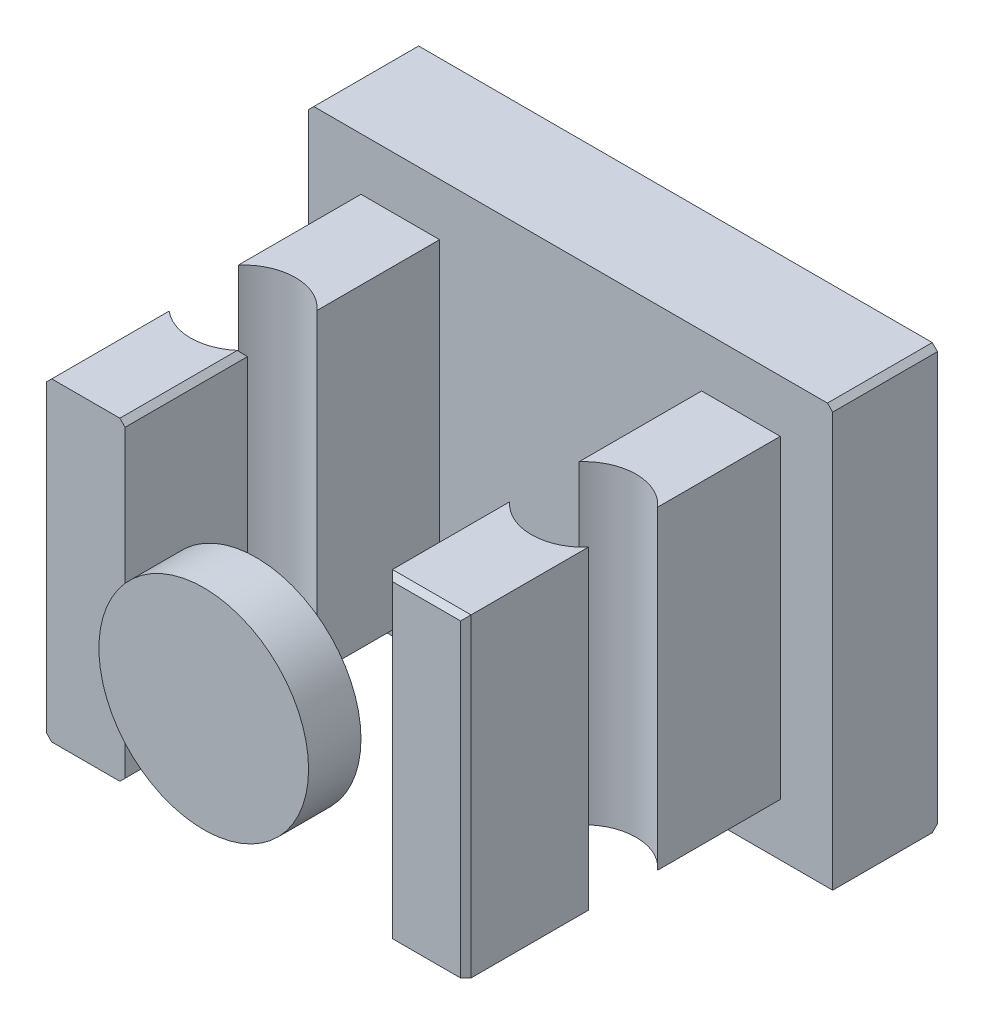
ISO-10303-21;
HEADER;
FILE_DESCRIPTION(('STEP AP214'),'2;1');
FILE_NAME('part.step','',(''),(''),'','','');
FILE_SCHEMA(('AUTOMOTIVE_DESIGN { 1 0 10303 214 1 1 1 1 }'));
ENDSEC;
DATA;
#1=APPLICATION_CONTEXT('core data for automotive mechanical design processes');
#2=APPLICATION_PROTOCOL_DEFINITION('international standard','automotive_design',2000,#1);
#3=PRODUCT_CONTEXT('',#1,'mechanical');
#4=PRODUCT('Part','Part','',(#3));
#5=PRODUCT_RELATED_PRODUCT_CATEGORY('part','',(#4));
#6=PRODUCT_DEFINITION_FORMATION('','',#4);
#7=PRODUCT_DEFINITION_CONTEXT('part definition',#1,'design');
#8=PRODUCT_DEFINITION('design','',#6,#7);
#9=PRODUCT_DEFINITION_SHAPE('','',#8);
#10=(LENGTH_UNIT() NAMED_UNIT(*) SI_UNIT(.MILLI.,.METRE.));
#11=(NAMED_UNIT(*) PLANE_ANGLE_UNIT() SI_UNIT($,.RADIAN.));
#12=(NAMED_UNIT(*) SI_UNIT($,.STERADIAN.) SOLID_ANGLE_UNIT());
#13=UNCERTAINTY_MEASURE_WITH_UNIT(LENGTH_MEASURE(1.E-05),#10,'distance_accuracy_value','');
#14=(GEOMETRIC_REPRESENTATION_CONTEXT(3) GLOBAL_UNCERTAINTY_ASSIGNED_CONTEXT((#13)) GLOBAL_UNIT_ASSIGNED_CONTEXT((#10,
#11,#12)) REPRESENTATION_CONTEXT('',''));
#15=CARTESIAN_POINT('',(0.,0.,0.));
#16=DIRECTION('',(0.,0.,1.));
#17=DIRECTION('',(1.,0.,0.));
#18=AXIS2_PLACEMENT_3D('',#15,#16,#17);
#19=CARTESIAN_POINT('',(0.,0.,90.));
#20=DIRECTION('',(0.,0.,-1.));
#21=DIRECTION('',(-1.,0.,0.));
#22=AXIS2_PLACEMENT_3D('',#19,#20,#21);
#23=CYLINDRICAL_SURFACE('',#22,20.);
#24=CARTESIAN_POINT('',(0.,0.,90.));
#25=DIRECTION('',(0.,0.,1.));
#26=DIRECTION('',(1.,0.,0.));
#27=AXIS2_PLACEMENT_3D('',#24,#25,#26);
#28=CIRCLE('',#27,20.);
#29=CARTESIAN_POINT('',(20.,0.,90.));
#30=VERTEX_POINT('',#29);
#31=EDGE_CURVE('E11',#30,#30,#28,.T.);
#32=ORIENTED_EDGE('',*,*,#31,.F.);
#33=EDGE_LOOP('',(#32));
#34=FACE_BOUND('',#33,.T.);
#35=CARTESIAN_POINT('',(0.,0.,80.));
#36=DIRECTION('',(0.,0.,1.));
#37=DIRECTION('',(1.,0.,0.));
#38=AXIS2_PLACEMENT_3D('',#35,#36,#37);
#39=CIRCLE('',#38,20.);
#40=CARTESIAN_POINT('',(20.,0.,80.));
#41=VERTEX_POINT('',#40);
#42=EDGE_CURVE('E54',#41,#41,#39,.T.);
#43=ORIENTED_EDGE('',*,*,#42,.T.);
#44=EDGE_LOOP('',(#43));
#45=FACE_BOUND('',#44,.T.);
#46=ADVANCED_FACE('F55',(#34,#45),#23,.T.);
#47=CARTESIAN_POINT('',(0.,0.,90.));
#48=DIRECTION('',(0.,0.,1.));
#49=DIRECTION('',(1.,0.,0.));
#50=AXIS2_PLACEMENT_3D('',#47,#48,#49);
#51=PLANE('',#50);
#52=ORIENTED_EDGE('',*,*,#31,.T.);
#53=EDGE_LOOP('',(#52));
#54=FACE_BOUND('',#53,.T.);
#55=ADVANCED_FACE('F67',(#54),#51,.T.);
#56=CARTESIAN_POINT('',(0.,0.,80.));
#57=DIRECTION('',(0.,0.,1.));
#58=DIRECTION('',(1.,0.,0.));
#59=AXIS2_PLACEMENT_3D('',#56,#57,#58);
#60=PLANE('',#59);
#61=ORIENTED_EDGE('',*,*,#42,.F.);
#62=EDGE_LOOP('',(#61));
#63=FACE_BOUND('',#62,.T.);
#64=ADVANCED_FACE('F65',(#63),#60,.F.);
#65=CLOSED_SHELL('',(#46,#55,#64));
#66=MANIFOLD_SOLID_BREP('B2',#65);
#67=CARTESIAN_POINT('',(25.,-30.,80.));
#68=DIRECTION('',(1.,0.,0.));
#69=DIRECTION('',(0.,0.,-1.));
#70=AXIS2_PLACEMENT_3D('',#67,#68,#69);
#71=PLANE('',#70);
#72=DIRECTION('',(0.,0.,-1.));
#73=VECTOR('',#72,1.);
#74=CARTESIAN_POINT('',(25.,-30.,80.));
#75=LINE('',#74,#73);
#76=CARTESIAN_POINT('',(25.,-30.,43.3856217223385));
#77=VERTEX_POINT('',#76);
#78=CARTESIAN_POINT('',(25.,-30.,20.));
#79=VERTEX_POINT('',#78);
#80=EDGE_CURVE('E230',#77,#79,#75,.T.);
#81=ORIENTED_EDGE('',*,*,#80,.F.);
#82=DIRECTION('',(0.,1.,0.));
#83=VECTOR('',#82,1.);
#84=CARTESIAN_POINT('',(25.,-100.,43.3856217223385));
#85=LINE('',#84,#83);
#86=CARTESIAN_POINT('',(25.,30.,43.3856217223385));
#87=VERTEX_POINT('',#86);
#88=EDGE_CURVE('E212',#77,#87,#85,.T.);
#89=ORIENTED_EDGE('',*,*,#88,.T.);
#90=DIRECTION('',(0.,0.,-1.));
#91=VECTOR('',#90,1.);
#92=CARTESIAN_POINT('',(25.,30.,80.));
#93=LINE('',#92,#91);
#94=CARTESIAN_POINT('',(25.,30.,20.));
#95=VERTEX_POINT('',#94);
#96=EDGE_CURVE('E221',#87,#95,#93,.T.);
#97=ORIENTED_EDGE('',*,*,#96,.T.);
#98=DIRECTION('',(0.,-1.,0.));
#99=VECTOR('',#98,1.);
#100=CARTESIAN_POINT('',(25.,-30.,20.));
#101=LINE('',#100,#99);
#102=EDGE_CURVE('E234',#95,#79,#101,.T.);
#103=ORIENTED_EDGE('',*,*,#102,.T.);
#104=EDGE_LOOP('',(#81,#89,#97,#103));
#105=FACE_BOUND('',#104,.T.);
#106=ADVANCED_FACE('F103',(#105),#71,.F.);
#107=CARTESIAN_POINT('',(25.,-30.,80.));
#108=DIRECTION('',(0.,1.,0.));
#109=DIRECTION('',(0.,0.,1.));
#110=AXIS2_PLACEMENT_3D('',#107,#108,#109);
#111=PLANE('',#110);
#112=DIRECTION('',(0.,0.,-1.));
#113=VECTOR('',#112,1.);
#114=CARTESIAN_POINT('',(40.,-30.,80.));
#115=LINE('',#114,#113);
#116=CARTESIAN_POINT('',(40.,-30.,43.3856217223385));
#117=VERTEX_POINT('',#116);
#118=CARTESIAN_POINT('',(40.,-30.,20.));
#119=VERTEX_POINT('',#118);
#120=EDGE_CURVE('E232',#117,#119,#115,.T.);
#121=ORIENTED_EDGE('',*,*,#120,.F.);
#122=CARTESIAN_POINT('',(32.5,-30.,50.));
#123=DIRECTION('',(0.,1.,0.));
#124=DIRECTION('',(0.,0.,1.));
#125=AXIS2_PLACEMENT_3D('',#122,#123,#124);
#126=CIRCLE('',#125,10.);
#127=EDGE_CURVE('E220',#117,#77,#126,.T.);
#128=ORIENTED_EDGE('',*,*,#127,.T.);
#129=ORIENTED_EDGE('',*,*,#80,.T.);
#130=DIRECTION('',(1.,0.,0.));
#131=VECTOR('',#130,1.);
#132=CARTESIAN_POINT('',(25.,-30.,20.));
#133=LINE('',#132,#131);
#134=EDGE_CURVE('E240',#79,#119,#133,.T.);
#135=ORIENTED_EDGE('',*,*,#134,.T.);
#136=EDGE_LOOP('',(#121,#128,#129,#135));
#137=FACE_BOUND('',#136,.T.);
#138=ADVANCED_FACE('F229',(#137),#111,.F.);
#139=CARTESIAN_POINT('',(-40.,-30.,80.));
#140=DIRECTION('',(1.,0.,0.));
#141=DIRECTION('',(0.,0.,-1.));
#142=AXIS2_PLACEMENT_3D('',#139,#140,#141);
#143=PLANE('',#142);
#144=DIRECTION('',(0.,0.,-1.));
#145=VECTOR('',#144,1.);
#146=CARTESIAN_POINT('',(-40.,-30.,80.));
#147=LINE('',#146,#145);
#148=CARTESIAN_POINT('',(-40.,-30.,43.3856217223385));
#149=VERTEX_POINT('',#148);
#150=CARTESIAN_POINT('',(-40.,-30.,20.));
#151=VERTEX_POINT('',#150);
#152=EDGE_CURVE('E264',#149,#151,#147,.T.);
#153=ORIENTED_EDGE('',*,*,#152,.F.);
#154=DIRECTION('',(0.,1.,0.));
#155=VECTOR('',#154,1.);
#156=CARTESIAN_POINT('',(-40.,-100.,43.3856217223385));
#157=LINE('',#156,#155);
#158=CARTESIAN_POINT('',(-40.,30.,43.3856217223385));
#159=VERTEX_POINT('',#158);
#160=EDGE_CURVE('E239',#149,#159,#157,.T.);
#161=ORIENTED_EDGE('',*,*,#160,.T.);
#162=DIRECTION('',(0.,0.,-1.));
#163=VECTOR('',#162,1.);
#164=CARTESIAN_POINT('',(-40.,30.,80.));
#165=LINE('',#164,#163);
#166=CARTESIAN_POINT('',(-40.,30.,20.));
#167=VERTEX_POINT('',#166);
#168=EDGE_CURVE('E259',#159,#167,#165,.T.);
#169=ORIENTED_EDGE('',*,*,#168,.T.);
#170=DIRECTION('',(0.,-1.,0.));
#171=VECTOR('',#170,1.);
#172=CARTESIAN_POINT('',(-40.,-30.,20.));
#173=LINE('',#172,#171);
#174=EDGE_CURVE('E261',#167,#151,#173,.T.);
#175=ORIENTED_EDGE('',*,*,#174,.T.);
#176=EDGE_LOOP('',(#153,#161,#169,#175));
#177=FACE_BOUND('',#176,.T.);
#178=ADVANCED_FACE('F343',(#177),#143,.F.);
#179=CARTESIAN_POINT('',(-40.,-30.,80.));
#180=DIRECTION('',(0.,1.,0.));
#181=DIRECTION('',(0.,0.,1.));
#182=AXIS2_PLACEMENT_3D('',#179,#180,#181);
#183=PLANE('',#182);
#184=DIRECTION('',(0.,0.,-1.));
#185=VECTOR('',#184,1.);
#186=CARTESIAN_POINT('',(-25.,-30.,80.));
#187=LINE('',#186,#185);
#188=CARTESIAN_POINT('',(-25.,-30.,43.3856217223385));
#189=VERTEX_POINT('',#188);
#190=CARTESIAN_POINT('',(-25.,-30.,20.));
#191=VERTEX_POINT('',#190);
#192=EDGE_CURVE('E248',#189,#191,#187,.T.);
#193=ORIENTED_EDGE('',*,*,#192,.F.);
#194=CARTESIAN_POINT('',(-32.5,-30.,50.));
#195=DIRECTION('',(0.,1.,0.));
#196=DIRECTION('',(0.,0.,1.));
#197=AXIS2_PLACEMENT_3D('',#194,#195,#196);
#198=CIRCLE('',#197,10.);
#199=EDGE_CURVE('E265',#189,#149,#198,.T.);
#200=ORIENTED_EDGE('',*,*,#199,.T.);
#201=ORIENTED_EDGE('',*,*,#152,.T.);
#202=DIRECTION('',(1.,0.,0.));
#203=VECTOR('',#202,1.);
#204=CARTESIAN_POINT('',(-40.,-30.,20.));
#205=LINE('',#204,#203);
#206=EDGE_CURVE('E270',#151,#191,#205,.T.);
#207=ORIENTED_EDGE('',*,*,#206,.T.);
#208=EDGE_LOOP('',(#193,#200,#201,#207));
#209=FACE_BOUND('',#208,.T.);
#210=ADVANCED_FACE('F358',(#209),#183,.F.);
#211=CARTESIAN_POINT('',(0.,0.,20.));
#212=DIRECTION('',(0.,0.,-1.));
#213=DIRECTION('',(-1.,0.,0.));
#214=AXIS2_PLACEMENT_3D('',#211,#212,#213);
#215=PLANE('',#214);
#216=DIRECTION('',(0.,1.,0.));
#217=VECTOR('',#216,1.);
#218=CARTESIAN_POINT('',(40.,-30.,20.));
#219=LINE('',#218,#217);
#220=CARTESIAN_POINT('',(40.,30.,20.));
#221=VERTEX_POINT('',#220);
#222=EDGE_CURVE('E249',#119,#221,#219,.T.);
#223=ORIENTED_EDGE('',*,*,#222,.F.);
#224=ORIENTED_EDGE('',*,*,#134,.F.);
#225=ORIENTED_EDGE('',*,*,#102,.F.);
#226=DIRECTION('',(-1.,0.,0.));
#227=VECTOR('',#226,1.);
#228=CARTESIAN_POINT('',(25.,30.,20.));
#229=LINE('',#228,#227);
#230=EDGE_CURVE('E246',#221,#95,#229,.T.);
#231=ORIENTED_EDGE('',*,*,#230,.F.);
#232=EDGE_LOOP('',(#223,#224,#225,#231));
#233=FACE_BOUND('',#232,.T.);
#234=DIRECTION('',(0.,-1.,0.));
#235=VECTOR('',#234,1.);
#236=CARTESIAN_POINT('',(-50.,-40.,20.));
#237=LINE('',#236,#235);
#238=CARTESIAN_POINT('',(-50.,39.,20.));
#239=VERTEX_POINT('',#238);
#240=CARTESIAN_POINT('',(-50.,-39.,20.));
#241=VERTEX_POINT('',#240);
#242=EDGE_CURVE('E318',#239,#241,#237,.T.);
#243=ORIENTED_EDGE('',*,*,#242,.T.);
#244=DIRECTION('',(-0.707106781186543,0.707106781186552,0.));
#245=VECTOR('',#244,1.);
#246=CARTESIAN_POINT('',(-49.,-40.,20.));
#247=LINE('',#246,#245);
#248=CARTESIAN_POINT('',(-49.,-40.,20.));
#249=VERTEX_POINT('',#248);
#250=EDGE_CURVE('E292',#241,#249,#247,.F.);
#251=ORIENTED_EDGE('',*,*,#250,.T.);
#252=DIRECTION('',(1.,0.,0.));
#253=VECTOR('',#252,1.);
#254=CARTESIAN_POINT('',(-50.,-40.,20.));
#255=LINE('',#254,#253);
#256=CARTESIAN_POINT('',(50.,-40.,20.));
#257=VERTEX_POINT('',#256);
#258=EDGE_CURVE('E316',#249,#257,#255,.T.);
#259=ORIENTED_EDGE('',*,*,#258,.T.);
#260=DIRECTION('',(0.,1.,0.));
#261=VECTOR('',#260,1.);
#262=CARTESIAN_POINT('',(50.,-40.,20.));
#263=LINE('',#262,#261);
#264=CARTESIAN_POINT('',(50.,39.,20.));
#265=VERTEX_POINT('',#264);
#266=EDGE_CURVE('E325',#257,#265,#263,.T.);
#267=ORIENTED_EDGE('',*,*,#266,.T.);
#268=DIRECTION('',(0.707106781186543,-0.707106781186552,0.));
#269=VECTOR('',#268,1.);
#270=CARTESIAN_POINT('',(49.,40.,20.));
#271=LINE('',#270,#269);
#272=CARTESIAN_POINT('',(49.,40.,20.));
#273=VERTEX_POINT('',#272);
#274=EDGE_CURVE('E125',#265,#273,#271,.F.);
#275=ORIENTED_EDGE('',*,*,#274,.T.);
#276=DIRECTION('',(-1.,0.,0.));
#277=VECTOR('',#276,1.);
#278=CARTESIAN_POINT('',(-50.,40.,20.));
#279=LINE('',#278,#277);
#280=CARTESIAN_POINT('',(-49.,40.,20.));
#281=VERTEX_POINT('',#280);
#282=EDGE_CURVE('E299',#273,#281,#279,.T.);
#283=ORIENTED_EDGE('',*,*,#282,.T.);
#284=DIRECTION('',(0.707106781186548,0.707106781186548,0.));
#285=VECTOR('',#284,1.);
#286=CARTESIAN_POINT('',(-50.,39.,20.));
#287=LINE('',#286,#285);
#288=EDGE_CURVE('E288',#281,#239,#287,.F.);
#289=ORIENTED_EDGE('',*,*,#288,.T.);
#290=EDGE_LOOP('',(#243,#251,#259,#267,#275,#283,#289));
#291=FACE_BOUND('',#290,.T.);
#292=DIRECTION('',(0.,1.,0.));
#293=VECTOR('',#292,1.);
#294=CARTESIAN_POINT('',(-25.,-30.,20.));
#295=LINE('',#294,#293);
#296=CARTESIAN_POINT('',(-25.,30.,20.));
#297=VERTEX_POINT('',#296);
#298=EDGE_CURVE('E253',#191,#297,#295,.T.);
#299=ORIENTED_EDGE('',*,*,#298,.F.);
#300=ORIENTED_EDGE('',*,*,#206,.F.);
#301=ORIENTED_EDGE('',*,*,#174,.F.);
#302=DIRECTION('',(-1.,0.,0.));
#303=VECTOR('',#302,1.);
#304=CARTESIAN_POINT('',(-40.,30.,20.));
#305=LINE('',#304,#303);
#306=EDGE_CURVE('E256',#297,#167,#305,.T.);
#307=ORIENTED_EDGE('',*,*,#306,.F.);
#308=EDGE_LOOP('',(#299,#300,#301,#307));
#309=FACE_BOUND('',#308,.T.);
#310=ADVANCED_FACE('F354',(#233,#291,#309),#215,.F.);
#311=CARTESIAN_POINT('',(50.,-40.,20.));
#312=DIRECTION('',(-1.,0.,0.));
#313=DIRECTION('',(0.,0.,1.));
#314=AXIS2_PLACEMENT_3D('',#311,#312,#313);
#315=PLANE('',#314);
#316=DIRECTION('',(0.,0.,-1.));
#317=VECTOR('',#316,1.);
#318=CARTESIAN_POINT('',(50.,-40.,20.));
#319=LINE('',#318,#317);
#320=CARTESIAN_POINT('',(50.,-40.,0.999999999999987));
#321=VERTEX_POINT('',#320);
#322=EDGE_CURVE('E308',#257,#321,#319,.T.);
#323=ORIENTED_EDGE('',*,*,#322,.T.);
#324=DIRECTION('',(0.,0.707106781186552,-0.707106781186543));
#325=VECTOR('',#324,1.);
#326=CARTESIAN_POINT('',(50.,-40.,0.999999999999987));
#327=LINE('',#326,#325);
#328=CARTESIAN_POINT('',(50.,-39.,0.));
#329=VERTEX_POINT('',#328);
#330=EDGE_CURVE('E274',#321,#329,#327,.T.);
#331=ORIENTED_EDGE('',*,*,#330,.T.);
#332=DIRECTION('',(0.,1.,0.));
#333=VECTOR('',#332,1.);
#334=CARTESIAN_POINT('',(50.,-40.,0.));
#335=LINE('',#334,#333);
#336=CARTESIAN_POINT('',(50.,39.,0.));
#337=VERTEX_POINT('',#336);
#338=EDGE_CURVE('E315',#329,#337,#335,.T.);
#339=ORIENTED_EDGE('',*,*,#338,.T.);
#340=DIRECTION('',(0.,0.,1.));
#341=VECTOR('',#340,1.);
#342=CARTESIAN_POINT('',(50.,39.,20.));
#343=LINE('',#342,#341);
#344=EDGE_CURVE('E272',#337,#265,#343,.T.);
#345=ORIENTED_EDGE('',*,*,#344,.T.);
#346=ORIENTED_EDGE('',*,*,#266,.F.);
#347=EDGE_LOOP('',(#323,#331,#339,#345,#346));
#348=FACE_BOUND('',#347,.T.);
#349=ADVANCED_FACE('F453',(#348),#315,.F.);
#350=CARTESIAN_POINT('',(-50.,40.,20.));
#351=DIRECTION('',(0.,-1.,0.));
#352=DIRECTION('',(0.,0.,-1.));
#353=AXIS2_PLACEMENT_3D('',#350,#351,#352);
#354=PLANE('',#353);
#355=DIRECTION('',(-1.,0.,0.));
#356=VECTOR('',#355,1.);
#357=CARTESIAN_POINT('',(-50.,40.,0.));
#358=LINE('',#357,#356);
#359=CARTESIAN_POINT('',(49.,40.,0.));
#360=VERTEX_POINT('',#359);
#361=CARTESIAN_POINT('',(-49.,40.,0.));
#362=VERTEX_POINT('',#361);
#363=EDGE_CURVE('E297',#360,#362,#358,.T.);
#364=ORIENTED_EDGE('',*,*,#363,.T.);
#365=DIRECTION('',(0.,0.,1.));
#366=VECTOR('',#365,1.);
#367=CARTESIAN_POINT('',(-49.,40.,20.));
#368=LINE('',#367,#366);
#369=EDGE_CURVE('E49',#362,#281,#368,.T.);
#370=ORIENTED_EDGE('',*,*,#369,.T.);
#371=ORIENTED_EDGE('',*,*,#282,.F.);
#372=DIRECTION('',(0.,0.,-1.));
#373=VECTOR('',#372,1.);
#374=CARTESIAN_POINT('',(49.,40.,20.));
#375=LINE('',#374,#373);
#376=EDGE_CURVE('E114',#273,#360,#375,.T.);
#377=ORIENTED_EDGE('',*,*,#376,.T.);
#378=EDGE_LOOP('',(#364,#370,#371,#377));
#379=FACE_BOUND('',#378,.T.);
#380=ADVANCED_FACE('F296',(#379),#354,.F.);
#381=CARTESIAN_POINT('',(-50.,-40.,20.));
#382=DIRECTION('',(1.,0.,0.));
#383=DIRECTION('',(0.,0.,-1.));
#384=AXIS2_PLACEMENT_3D('',#381,#382,#383);
#385=PLANE('',#384);
#386=DIRECTION('',(0.,-1.,0.));
#387=VECTOR('',#386,1.);
#388=CARTESIAN_POINT('',(-50.,-40.,0.));
#389=LINE('',#388,#387);
#390=CARTESIAN_POINT('',(-50.,39.,0.));
#391=VERTEX_POINT('',#390);
#392=CARTESIAN_POINT('',(-50.,-39.,0.));
#393=VERTEX_POINT('',#392);
#394=EDGE_CURVE('E305',#391,#393,#389,.T.);
#395=ORIENTED_EDGE('',*,*,#394,.T.);
#396=DIRECTION('',(0.,0.,1.));
#397=VECTOR('',#396,1.);
#398=CARTESIAN_POINT('',(-50.,-39.,20.));
#399=LINE('',#398,#397);
#400=EDGE_CURVE('E286',#393,#241,#399,.T.);
#401=ORIENTED_EDGE('',*,*,#400,.T.);
#402=ORIENTED_EDGE('',*,*,#242,.F.);
#403=DIRECTION('',(0.,0.,-1.));
#404=VECTOR('',#403,1.);
#405=CARTESIAN_POINT('',(-50.,39.,20.));
#406=LINE('',#405,#404);
#407=EDGE_CURVE('E284',#239,#391,#406,.T.);
#408=ORIENTED_EDGE('',*,*,#407,.T.);
#409=EDGE_LOOP('',(#395,#401,#402,#408));
#410=FACE_BOUND('',#409,.T.);
#411=ADVANCED_FACE('F469',(#410),#385,.F.);
#412=CARTESIAN_POINT('',(-50.,-40.,20.));
#413=DIRECTION('',(0.,1.,0.));
#414=DIRECTION('',(0.,0.,1.));
#415=AXIS2_PLACEMENT_3D('',#412,#413,#414);
#416=PLANE('',#415);
#417=DIRECTION('',(0.,0.,-1.));
#418=VECTOR('',#417,1.);
#419=CARTESIAN_POINT('',(-49.,-40.,20.));
#420=LINE('',#419,#418);
#421=CARTESIAN_POINT('',(-49.,-40.,0.999999999999987));
#422=VERTEX_POINT('',#421);
#423=EDGE_CURVE('E268',#249,#422,#420,.T.);
#424=ORIENTED_EDGE('',*,*,#423,.T.);
#425=DIRECTION('',(1.,0.,0.));
#426=VECTOR('',#425,1.);
#427=CARTESIAN_POINT('',(50.,-40.,0.999999999999987));
#428=LINE('',#427,#426);
#429=EDGE_CURVE('E269',#422,#321,#428,.T.);
#430=ORIENTED_EDGE('',*,*,#429,.T.);
#431=ORIENTED_EDGE('',*,*,#322,.F.);
#432=ORIENTED_EDGE('',*,*,#258,.F.);
#433=EDGE_LOOP('',(#424,#430,#431,#432));
#434=FACE_BOUND('',#433,.T.);
#435=ADVANCED_FACE('F458',(#434),#416,.F.);
#436=CARTESIAN_POINT('',(0.,0.,0.));
#437=DIRECTION('',(0.,0.,-1.));
#438=DIRECTION('',(-1.,0.,0.));
#439=AXIS2_PLACEMENT_3D('',#436,#437,#438);
#440=PLANE('',#439);
#441=ORIENTED_EDGE('',*,*,#338,.F.);
#442=DIRECTION('',(-1.,0.,0.));
#443=VECTOR('',#442,1.);
#444=CARTESIAN_POINT('',(-50.,-39.,0.));
#445=LINE('',#444,#443);
#446=EDGE_CURVE('E281',#329,#393,#445,.T.);
#447=ORIENTED_EDGE('',*,*,#446,.T.);
#448=ORIENTED_EDGE('',*,*,#394,.F.);
#449=DIRECTION('',(-0.707106781186548,-0.707106781186548,0.));
#450=VECTOR('',#449,1.);
#451=CARTESIAN_POINT('',(-44.5,44.5,0.));
#452=LINE('',#451,#450);
#453=EDGE_CURVE('E276',#391,#362,#452,.F.);
#454=ORIENTED_EDGE('',*,*,#453,.T.);
#455=ORIENTED_EDGE('',*,*,#363,.F.);
#456=DIRECTION('',(-0.707106781186543,0.707106781186552,0.));
#457=VECTOR('',#456,1.);
#458=CARTESIAN_POINT('',(44.5000000000004,44.4999999999997,0.));
#459=LINE('',#458,#457);
#460=EDGE_CURVE('E280',#360,#337,#459,.F.);
#461=ORIENTED_EDGE('',*,*,#460,.T.);
#462=EDGE_LOOP('',(#441,#447,#448,#454,#455,#461));
#463=FACE_BOUND('',#462,.T.);
#464=ADVANCED_FACE('F302',(#463),#440,.T.);
#465=CARTESIAN_POINT('',(40.,-30.,80.));
#466=DIRECTION('',(-1.,0.,0.));
#467=DIRECTION('',(0.,0.,1.));
#468=AXIS2_PLACEMENT_3D('',#465,#466,#467);
#469=PLANE('',#468);
#470=DIRECTION('',(0.,0.,-1.));
#471=VECTOR('',#470,1.);
#472=CARTESIAN_POINT('',(40.,30.,80.));
#473=LINE('',#472,#471);
#474=CARTESIAN_POINT('',(40.,30.,43.3856217223385));
#475=VERTEX_POINT('',#474);
#476=EDGE_CURVE('E243',#475,#221,#473,.T.);
#477=ORIENTED_EDGE('',*,*,#476,.F.);
#478=DIRECTION('',(0.,1.,0.));
#479=VECTOR('',#478,1.);
#480=CARTESIAN_POINT('',(40.,-100.,43.3856217223385));
#481=LINE('',#480,#479);
#482=EDGE_CURVE('E310',#475,#117,#481,.F.);
#483=ORIENTED_EDGE('',*,*,#482,.T.);
#484=ORIENTED_EDGE('',*,*,#120,.T.);
#485=ORIENTED_EDGE('',*,*,#222,.T.);
#486=EDGE_LOOP('',(#477,#483,#484,#485));
#487=FACE_BOUND('',#486,.T.);
#488=ADVANCED_FACE('F382',(#487),#469,.F.);
#489=CARTESIAN_POINT('',(25.,30.,80.));
#490=DIRECTION('',(0.,-1.,0.));
#491=DIRECTION('',(0.,0.,-1.));
#492=AXIS2_PLACEMENT_3D('',#489,#490,#491);
#493=PLANE('',#492);
#494=ORIENTED_EDGE('',*,*,#96,.F.);
#495=CARTESIAN_POINT('',(32.5,30.,50.));
#496=DIRECTION('',(0.,-1.,0.));
#497=DIRECTION('',(0.,0.,-1.));
#498=AXIS2_PLACEMENT_3D('',#495,#496,#497);
#499=CIRCLE('',#498,10.);
#500=EDGE_CURVE('E219',#87,#475,#499,.T.);
#501=ORIENTED_EDGE('',*,*,#500,.T.);
#502=ORIENTED_EDGE('',*,*,#476,.T.);
#503=ORIENTED_EDGE('',*,*,#230,.T.);
#504=EDGE_LOOP('',(#494,#501,#502,#503));
#505=FACE_BOUND('',#504,.T.);
#506=ADVANCED_FACE('F379',(#505),#493,.F.);
#507=CARTESIAN_POINT('',(-25.,-30.,80.));
#508=DIRECTION('',(-1.,0.,0.));
#509=DIRECTION('',(0.,0.,1.));
#510=AXIS2_PLACEMENT_3D('',#507,#508,#509);
#511=PLANE('',#510);
#512=DIRECTION('',(0.,0.,-1.));
#513=VECTOR('',#512,1.);
#514=CARTESIAN_POINT('',(-25.,30.,80.));
#515=LINE('',#514,#513);
#516=CARTESIAN_POINT('',(-25.,30.,43.3856217223385));
#517=VERTEX_POINT('',#516);
#518=EDGE_CURVE('E258',#517,#297,#515,.T.);
#519=ORIENTED_EDGE('',*,*,#518,.F.);
#520=DIRECTION('',(0.,1.,0.));
#521=VECTOR('',#520,1.);
#522=CARTESIAN_POINT('',(-25.,-100.,43.3856217223385));
#523=LINE('',#522,#521);
#524=EDGE_CURVE('E252',#517,#189,#523,.F.);
#525=ORIENTED_EDGE('',*,*,#524,.T.);
#526=ORIENTED_EDGE('',*,*,#192,.T.);
#527=ORIENTED_EDGE('',*,*,#298,.T.);
#528=EDGE_LOOP('',(#519,#525,#526,#527));
#529=FACE_BOUND('',#528,.T.);
#530=ADVANCED_FACE('F356',(#529),#511,.F.);
#531=CARTESIAN_POINT('',(-40.,30.,80.));
#532=DIRECTION('',(0.,-1.,0.));
#533=DIRECTION('',(0.,0.,-1.));
#534=AXIS2_PLACEMENT_3D('',#531,#532,#533);
#535=PLANE('',#534);
#536=ORIENTED_EDGE('',*,*,#168,.F.);
#537=CARTESIAN_POINT('',(-32.5,30.,50.));
#538=DIRECTION('',(0.,-1.,0.));
#539=DIRECTION('',(0.,0.,-1.));
#540=AXIS2_PLACEMENT_3D('',#537,#538,#539);
#541=CIRCLE('',#540,10.);
#542=EDGE_CURVE('E251',#159,#517,#541,.T.);
#543=ORIENTED_EDGE('',*,*,#542,.T.);
#544=ORIENTED_EDGE('',*,*,#518,.T.);
#545=ORIENTED_EDGE('',*,*,#306,.T.);
#546=EDGE_LOOP('',(#536,#543,#544,#545));
#547=FACE_BOUND('',#546,.T.);
#548=ADVANCED_FACE('F346',(#547),#535,.F.);
#549=CARTESIAN_POINT('',(-32.5,-100.,50.));
#550=DIRECTION('',(0.,1.,0.));
#551=DIRECTION('',(0.,0.,1.));
#552=AXIS2_PLACEMENT_3D('',#549,#550,#551);
#553=CYLINDRICAL_SURFACE('',#552,10.);
#554=ORIENTED_EDGE('',*,*,#542,.F.);
#555=ORIENTED_EDGE('',*,*,#160,.F.);
#556=ORIENTED_EDGE('',*,*,#199,.F.);
#557=ORIENTED_EDGE('',*,*,#524,.F.);
#558=EDGE_LOOP('',(#554,#555,#556,#557));
#559=FACE_BOUND('',#558,.T.);
#560=ADVANCED_FACE('F360',(#559),#553,.F.);
#561=CARTESIAN_POINT('',(32.5,-100.,50.));
#562=DIRECTION('',(0.,1.,0.));
#563=DIRECTION('',(0.,0.,1.));
#564=AXIS2_PLACEMENT_3D('',#561,#562,#563);
#565=CYLINDRICAL_SURFACE('',#564,10.);
#566=ORIENTED_EDGE('',*,*,#500,.F.);
#567=ORIENTED_EDGE('',*,*,#88,.F.);
#568=ORIENTED_EDGE('',*,*,#127,.F.);
#569=ORIENTED_EDGE('',*,*,#482,.F.);
#570=EDGE_LOOP('',(#566,#567,#568,#569));
#571=FACE_BOUND('',#570,.T.);
#572=ADVANCED_FACE('F216',(#571),#565,.F.);
#573=CARTESIAN_POINT('',(-49.,-40.,20.));
#574=DIRECTION('',(0.707106781186552,0.707106781186543,0.));
#575=DIRECTION('',(0.,0.,-1.));
#576=AXIS2_PLACEMENT_3D('',#573,#574,#575);
#577=PLANE('',#576);
#578=ORIENTED_EDGE('',*,*,#250,.F.);
#579=ORIENTED_EDGE('',*,*,#400,.F.);
#580=DIRECTION('',(-0.577350269189623,0.577350269189631,-0.577350269189623));
#581=VECTOR('',#580,1.);
#582=CARTESIAN_POINT('',(-42.6666666666667,-46.3333333333334,7.33333333333326));
#583=LINE('',#582,#581);
#584=EDGE_CURVE('E107',#422,#393,#583,.T.);
#585=ORIENTED_EDGE('',*,*,#584,.F.);
#586=ORIENTED_EDGE('',*,*,#423,.F.);
#587=EDGE_LOOP('',(#578,#579,#585,#586));
#588=FACE_BOUND('',#587,.T.);
#589=ADVANCED_FACE('F370',(#588),#577,.F.);
#590=CARTESIAN_POINT('',(-50.,-40.,0.999999999999987));
#591=DIRECTION('',(0.,-0.707106781186543,-0.707106781186552));
#592=DIRECTION('',(-1.,0.,0.));
#593=AXIS2_PLACEMENT_3D('',#590,#591,#592);
#594=PLANE('',#593);
#595=ORIENTED_EDGE('',*,*,#584,.T.);
#596=ORIENTED_EDGE('',*,*,#446,.F.);
#597=ORIENTED_EDGE('',*,*,#330,.F.);
#598=ORIENTED_EDGE('',*,*,#429,.F.);
#599=EDGE_LOOP('',(#595,#596,#597,#598));
#600=FACE_BOUND('',#599,.T.);
#601=ADVANCED_FACE('F425',(#600),#594,.T.);
#602=CARTESIAN_POINT('',(-50.,39.,20.));
#603=DIRECTION('',(0.707106781186547,-0.707106781186547,0.));
#604=DIRECTION('',(0.,0.,-1.));
#605=AXIS2_PLACEMENT_3D('',#602,#603,#604);
#606=PLANE('',#605);
#607=ORIENTED_EDGE('',*,*,#288,.F.);
#608=ORIENTED_EDGE('',*,*,#369,.F.);
#609=ORIENTED_EDGE('',*,*,#453,.F.);
#610=ORIENTED_EDGE('',*,*,#407,.F.);
#611=EDGE_LOOP('',(#607,#608,#609,#610));
#612=FACE_BOUND('',#611,.T.);
#613=ADVANCED_FACE('F433',(#612),#606,.F.);
#614=CARTESIAN_POINT('',(49.,40.,20.));
#615=DIRECTION('',(-0.707106781186552,-0.707106781186543,0.));
#616=DIRECTION('',(0.,0.,-1.));
#617=AXIS2_PLACEMENT_3D('',#614,#615,#616);
#618=PLANE('',#617);
#619=ORIENTED_EDGE('',*,*,#274,.F.);
#620=ORIENTED_EDGE('',*,*,#344,.F.);
#621=ORIENTED_EDGE('',*,*,#460,.F.);
#622=ORIENTED_EDGE('',*,*,#376,.F.);
#623=EDGE_LOOP('',(#619,#620,#621,#622));
#624=FACE_BOUND('',#623,.T.);
#625=ADVANCED_FACE('F106',(#624),#618,.F.);
#626=CLOSED_SHELL('',(#106,#138,#178,#210,#310,#349,#380,#411,#435,#464,#488,#506,#530,#548,
#560,#572,#589,#601,#613,#625));
#627=MANIFOLD_SOLID_BREP('B6',#626);
#628=CARTESIAN_POINT('',(0.,0.,80.));
#629=DIRECTION('',(0.,0.,-1.));
#630=DIRECTION('',(-1.,0.,0.));
#631=AXIS2_PLACEMENT_3D('',#628,#629,#630);
#632=PLANE('',#631);
#633=DIRECTION('',(0.,-1.,0.));
#634=VECTOR('',#633,1.);
#635=CARTESIAN_POINT('',(-40.,-30.,80.));
#636=LINE('',#635,#634);
#637=CARTESIAN_POINT('',(-40.,29.,80.));
#638=VERTEX_POINT('',#637);
#639=CARTESIAN_POINT('',(-40.,-29.,80.));
#640=VERTEX_POINT('',#639);
#641=EDGE_CURVE('E674',#638,#640,#636,.T.);
#642=ORIENTED_EDGE('',*,*,#641,.T.);
#643=DIRECTION('',(-0.70710678118654,0.707106781186555,0.));
#644=VECTOR('',#643,1.);
#645=CARTESIAN_POINT('',(-39.,-30.,80.));
#646=LINE('',#645,#644);
#647=CARTESIAN_POINT('',(-39.,-30.,80.));
#648=VERTEX_POINT('',#647);
#649=EDGE_CURVE('E699',#640,#648,#646,.F.);
#650=ORIENTED_EDGE('',*,*,#649,.T.);
#651=DIRECTION('',(1.,0.,0.));
#652=VECTOR('',#651,1.);
#653=CARTESIAN_POINT('',(-40.,-30.,80.));
#654=LINE('',#653,#652);
#655=CARTESIAN_POINT('',(-26.,-30.,80.));
#656=VERTEX_POINT('',#655);
#657=EDGE_CURVE('E664',#648,#656,#654,.T.);
#658=ORIENTED_EDGE('',*,*,#657,.T.);
#659=DIRECTION('',(-0.70710678118655,-0.707106781186545,0.));
#660=VECTOR('',#659,1.);
#661=CARTESIAN_POINT('',(-25.,-29.,80.));
#662=LINE('',#661,#660);
#663=CARTESIAN_POINT('',(-25.,-29.,80.));
#664=VERTEX_POINT('',#663);
#665=EDGE_CURVE('E700',#656,#664,#662,.F.);
#666=ORIENTED_EDGE('',*,*,#665,.T.);
#667=DIRECTION('',(0.,1.,0.));
#668=VECTOR('',#667,1.);
#669=CARTESIAN_POINT('',(-25.,-30.,80.));
#670=LINE('',#669,#668);
#671=CARTESIAN_POINT('',(-25.,29.,80.));
#672=VERTEX_POINT('',#671);
#673=EDGE_CURVE('E678',#664,#672,#670,.T.);
#674=ORIENTED_EDGE('',*,*,#673,.T.);
#675=DIRECTION('',(0.707106781186543,-0.707106781186552,0.));
#676=VECTOR('',#675,1.);
#677=CARTESIAN_POINT('',(-26.,30.,80.));
#678=LINE('',#677,#676);
#679=CARTESIAN_POINT('',(-26.,30.,80.));
#680=VERTEX_POINT('',#679);
#681=EDGE_CURVE('E598',#672,#680,#678,.F.);
#682=ORIENTED_EDGE('',*,*,#681,.T.);
#683=DIRECTION('',(-1.,0.,0.));
#684=VECTOR('',#683,1.);
#685=CARTESIAN_POINT('',(-40.,30.,80.));
#686=LINE('',#685,#684);
#687=CARTESIAN_POINT('',(-39.,30.,80.));
#688=VERTEX_POINT('',#687);
#689=EDGE_CURVE('E676',#680,#688,#686,.T.);
#690=ORIENTED_EDGE('',*,*,#689,.T.);
#691=DIRECTION('',(0.707106781186552,0.707106781186543,0.));
#692=VECTOR('',#691,1.);
#693=CARTESIAN_POINT('',(-40.,29.,80.));
#694=LINE('',#693,#692);
#695=EDGE_CURVE('E695',#688,#638,#694,.F.);
#696=ORIENTED_EDGE('',*,*,#695,.T.);
#697=EDGE_LOOP('',(#642,#650,#658,#666,#674,#682,#690,#696));
#698=FACE_BOUND('',#697,.T.);
#699=ADVANCED_FACE('F576',(#698),#632,.F.);
#700=CARTESIAN_POINT('',(-40.,-30.,80.));
#701=DIRECTION('',(0.,1.,0.));
#702=DIRECTION('',(0.,0.,1.));
#703=AXIS2_PLACEMENT_3D('',#700,#701,#702);
#704=PLANE('',#703);
#705=ORIENTED_EDGE('',*,*,#657,.F.);
#706=DIRECTION('',(0.,0.,-1.));
#707=VECTOR('',#706,1.);
#708=CARTESIAN_POINT('',(-39.,-30.,80.));
#709=LINE('',#708,#707);
#710=CARTESIAN_POINT('',(-39.,-30.,57.5993420767853));
#711=VERTEX_POINT('',#710);
#712=EDGE_CURVE('E650',#648,#711,#709,.T.);
#713=ORIENTED_EDGE('',*,*,#712,.T.);
#714=CARTESIAN_POINT('',(-32.5,-30.,50.));
#715=DIRECTION('',(0.,1.,0.));
#716=DIRECTION('',(0.,0.,1.));
#717=AXIS2_PLACEMENT_3D('',#714,#715,#716);
#718=CIRCLE('',#717,10.);
#719=CARTESIAN_POINT('',(-26.,-30.,57.5993420767854));
#720=VERTEX_POINT('',#719);
#721=EDGE_CURVE('E659',#711,#720,#718,.T.);
#722=ORIENTED_EDGE('',*,*,#721,.T.);
#723=DIRECTION('',(0.,0.,1.));
#724=VECTOR('',#723,1.);
#725=CARTESIAN_POINT('',(-26.,-30.,80.));
#726=LINE('',#725,#724);
#727=EDGE_CURVE('E663',#720,#656,#726,.T.);
#728=ORIENTED_EDGE('',*,*,#727,.T.);
#729=EDGE_LOOP('',(#705,#713,#722,#728));
#730=FACE_BOUND('',#729,.T.);
#731=ADVANCED_FACE('F658',(#730),#704,.F.);
#732=CARTESIAN_POINT('',(-40.,-30.,80.));
#733=DIRECTION('',(1.,0.,0.));
#734=DIRECTION('',(0.,0.,-1.));
#735=AXIS2_PLACEMENT_3D('',#732,#733,#734);
#736=PLANE('',#735);
#737=DIRECTION('',(0.,1.,0.));
#738=VECTOR('',#737,1.);
#739=CARTESIAN_POINT('',(-40.,-100.,56.6143782776615));
#740=LINE('',#739,#738);
#741=CARTESIAN_POINT('',(-40.,29.,56.6143782776615));
#742=VERTEX_POINT('',#741);
#743=CARTESIAN_POINT('',(-40.,-29.,56.6143782776615));
#744=VERTEX_POINT('',#743);
#745=EDGE_CURVE('E668',#742,#744,#740,.F.);
#746=ORIENTED_EDGE('',*,*,#745,.T.);
#747=DIRECTION('',(0.,0.,1.));
#748=VECTOR('',#747,1.);
#749=CARTESIAN_POINT('',(-40.,-29.,80.));
#750=LINE('',#749,#748);
#751=EDGE_CURVE('E648',#744,#640,#750,.T.);
#752=ORIENTED_EDGE('',*,*,#751,.T.);
#753=ORIENTED_EDGE('',*,*,#641,.F.);
#754=DIRECTION('',(0.,0.,-1.));
#755=VECTOR('',#754,1.);
#756=CARTESIAN_POINT('',(-40.,29.,80.));
#757=LINE('',#756,#755);
#758=EDGE_CURVE('E653',#638,#742,#757,.T.);
#759=ORIENTED_EDGE('',*,*,#758,.T.);
#760=EDGE_LOOP('',(#746,#752,#753,#759));
#761=FACE_BOUND('',#760,.T.);
#762=ADVANCED_FACE('F722',(#761),#736,.F.);
#763=CARTESIAN_POINT('',(-40.,30.,80.));
#764=DIRECTION('',(0.,-1.,0.));
#765=DIRECTION('',(0.,0.,-1.));
#766=AXIS2_PLACEMENT_3D('',#763,#764,#765);
#767=PLANE('',#766);
#768=ORIENTED_EDGE('',*,*,#689,.F.);
#769=DIRECTION('',(0.,0.,-1.));
#770=VECTOR('',#769,1.);
#771=CARTESIAN_POINT('',(-26.,30.,80.));
#772=LINE('',#771,#770);
#773=CARTESIAN_POINT('',(-26.,30.,57.5993420767853));
#774=VERTEX_POINT('',#773);
#775=EDGE_CURVE('E101',#680,#774,#772,.T.);
#776=ORIENTED_EDGE('',*,*,#775,.T.);
#777=CARTESIAN_POINT('',(-32.5,30.,50.));
#778=DIRECTION('',(0.,-1.,0.));
#779=DIRECTION('',(0.,0.,-1.));
#780=AXIS2_PLACEMENT_3D('',#777,#778,#779);
#781=CIRCLE('',#780,10.);
#782=CARTESIAN_POINT('',(-39.,30.,57.5993420767854));
#783=VERTEX_POINT('',#782);
#784=EDGE_CURVE('E671',#774,#783,#781,.T.);
#785=ORIENTED_EDGE('',*,*,#784,.T.);
#786=DIRECTION('',(0.,0.,1.));
#787=VECTOR('',#786,1.);
#788=CARTESIAN_POINT('',(-39.,30.,80.));
#789=LINE('',#788,#787);
#790=EDGE_CURVE('E584',#783,#688,#789,.T.);
#791=ORIENTED_EDGE('',*,*,#790,.T.);
#792=EDGE_LOOP('',(#768,#776,#785,#791));
#793=FACE_BOUND('',#792,.T.);
#794=ADVANCED_FACE('F717',(#793),#767,.F.);
#795=CARTESIAN_POINT('',(-25.,-30.,80.));
#796=DIRECTION('',(-1.,0.,0.));
#797=DIRECTION('',(0.,0.,1.));
#798=AXIS2_PLACEMENT_3D('',#795,#796,#797);
#799=PLANE('',#798);
#800=ORIENTED_EDGE('',*,*,#673,.F.);
#801=DIRECTION('',(0.,0.,-1.));
#802=VECTOR('',#801,1.);
#803=CARTESIAN_POINT('',(-25.,-29.,80.));
#804=LINE('',#803,#802);
#805=CARTESIAN_POINT('',(-25.,-29.,56.6143782776615));
#806=VERTEX_POINT('',#805);
#807=EDGE_CURVE('E703',#664,#806,#804,.T.);
#808=ORIENTED_EDGE('',*,*,#807,.T.);
#809=DIRECTION('',(0.,1.,0.));
#810=VECTOR('',#809,1.);
#811=CARTESIAN_POINT('',(-25.,-100.,56.6143782776615));
#812=LINE('',#811,#810);
#813=CARTESIAN_POINT('',(-25.,29.,56.6143782776615));
#814=VERTEX_POINT('',#813);
#815=EDGE_CURVE('E682',#806,#814,#812,.T.);
#816=ORIENTED_EDGE('',*,*,#815,.T.);
#817=DIRECTION('',(0.,0.,1.));
#818=VECTOR('',#817,1.);
#819=CARTESIAN_POINT('',(-25.,29.,80.));
#820=LINE('',#819,#818);
#821=EDGE_CURVE('E701',#814,#672,#820,.T.);
#822=ORIENTED_EDGE('',*,*,#821,.T.);
#823=EDGE_LOOP('',(#800,#808,#816,#822));
#824=FACE_BOUND('',#823,.T.);
#825=ADVANCED_FACE('F708',(#824),#799,.F.);
#826=CARTESIAN_POINT('',(-32.5,-100.,50.));
#827=DIRECTION('',(0.,1.,0.));
#828=DIRECTION('',(0.,0.,1.));
#829=AXIS2_PLACEMENT_3D('',#826,#827,#828);
#830=CYLINDRICAL_SURFACE('',#829,10.);
#831=ORIENTED_EDGE('',*,*,#721,.F.);
#832=CARTESIAN_POINT('',(-32.5,-36.5000000000001,50.));
#833=DIRECTION('',(0.707106781186555,0.70710678118654,0.));
#834=DIRECTION('',(-0.70710678118654,0.707106781186555,0.));
#835=AXIS2_PLACEMENT_3D('',#832,#833,#834);
#836=ELLIPSE('',#835,14.1421356237311,10.);
#837=EDGE_CURVE('E641',#711,#744,#836,.F.);
#838=ORIENTED_EDGE('',*,*,#837,.T.);
#839=ORIENTED_EDGE('',*,*,#745,.F.);
#840=CARTESIAN_POINT('',(-32.5,36.4999999999999,50.));
#841=DIRECTION('',(0.707106781186542,-0.707106781186552,0.));
#842=DIRECTION('',(0.707106781186552,0.707106781186543,0.));
#843=AXIS2_PLACEMENT_3D('',#840,#841,#842);
#844=ELLIPSE('',#843,14.1421356237309,10.);
#845=EDGE_CURVE('E661',#742,#783,#844,.F.);
#846=ORIENTED_EDGE('',*,*,#845,.T.);
#847=ORIENTED_EDGE('',*,*,#784,.F.);
#848=CARTESIAN_POINT('',(-32.5,36.5000000000001,50.));
#849=DIRECTION('',(-0.707106781186552,-0.707106781186542,0.));
#850=DIRECTION('',(-0.707106781186543,0.707106781186552,0.));
#851=AXIS2_PLACEMENT_3D('',#848,#849,#850);
#852=ELLIPSE('',#851,14.1421356237311,10.);
#853=EDGE_CURVE('E689',#774,#814,#852,.F.);
#854=ORIENTED_EDGE('',*,*,#853,.T.);
#855=ORIENTED_EDGE('',*,*,#815,.F.);
#856=CARTESIAN_POINT('',(-32.5,-36.4999999999999,50.));
#857=DIRECTION('',(-0.707106781186545,0.70710678118655,0.));
#858=DIRECTION('',(0.70710678118655,0.707106781186545,0.));
#859=AXIS2_PLACEMENT_3D('',#856,#857,#858);
#860=ELLIPSE('',#859,14.1421356237309,10.);
#861=EDGE_CURVE('E652',#806,#720,#860,.F.);
#862=ORIENTED_EDGE('',*,*,#861,.T.);
#863=EDGE_LOOP('',(#831,#838,#839,#846,#847,#854,#855,#862));
#864=FACE_BOUND('',#863,.T.);
#865=ADVANCED_FACE('F667',(#864),#830,.F.);
#866=CARTESIAN_POINT('',(-39.,-30.,80.));
#867=DIRECTION('',(0.707106781186555,0.70710678118654,0.));
#868=DIRECTION('',(0.,0.,-1.));
#869=AXIS2_PLACEMENT_3D('',#866,#867,#868);
#870=PLANE('',#869);
#871=ORIENTED_EDGE('',*,*,#649,.F.);
#872=ORIENTED_EDGE('',*,*,#751,.F.);
#873=ORIENTED_EDGE('',*,*,#837,.F.);
#874=ORIENTED_EDGE('',*,*,#712,.F.);
#875=EDGE_LOOP('',(#871,#872,#873,#874));
#876=FACE_BOUND('',#875,.T.);
#877=ADVANCED_FACE('F646',(#876),#870,.F.);
#878=CARTESIAN_POINT('',(-25.,-29.,80.));
#879=DIRECTION('',(-0.707106781186545,0.70710678118655,0.));
#880=DIRECTION('',(0.,0.,-1.));
#881=AXIS2_PLACEMENT_3D('',#878,#879,#880);
#882=PLANE('',#881);
#883=ORIENTED_EDGE('',*,*,#665,.F.);
#884=ORIENTED_EDGE('',*,*,#727,.F.);
#885=ORIENTED_EDGE('',*,*,#861,.F.);
#886=ORIENTED_EDGE('',*,*,#807,.F.);
#887=EDGE_LOOP('',(#883,#884,#885,#886));
#888=FACE_BOUND('',#887,.T.);
#889=ADVANCED_FACE('F724',(#888),#882,.F.);
#890=CARTESIAN_POINT('',(-26.,30.,80.));
#891=DIRECTION('',(-0.707106781186552,-0.707106781186542,0.));
#892=DIRECTION('',(0.,0.,-1.));
#893=AXIS2_PLACEMENT_3D('',#890,#891,#892);
#894=PLANE('',#893);
#895=ORIENTED_EDGE('',*,*,#681,.F.);
#896=ORIENTED_EDGE('',*,*,#821,.F.);
#897=ORIENTED_EDGE('',*,*,#853,.F.);
#898=ORIENTED_EDGE('',*,*,#775,.F.);
#899=EDGE_LOOP('',(#895,#896,#897,#898));
#900=FACE_BOUND('',#899,.T.);
#901=ADVANCED_FACE('F714',(#900),#894,.F.);
#902=CARTESIAN_POINT('',(-40.,29.,80.));
#903=DIRECTION('',(0.707106781186542,-0.707106781186552,0.));
#904=DIRECTION('',(0.,0.,-1.));
#905=AXIS2_PLACEMENT_3D('',#902,#903,#904);
#906=PLANE('',#905);
#907=ORIENTED_EDGE('',*,*,#695,.F.);
#908=ORIENTED_EDGE('',*,*,#790,.F.);
#909=ORIENTED_EDGE('',*,*,#845,.F.);
#910=ORIENTED_EDGE('',*,*,#758,.F.);
#911=EDGE_LOOP('',(#907,#908,#909,#910));
#912=FACE_BOUND('',#911,.T.);
#913=ADVANCED_FACE('F578',(#912),#906,.F.);
#914=CLOSED_SHELL('',(#699,#731,#762,#794,#825,#865,#877,#889,#901,#913));
#915=MANIFOLD_SOLID_BREP('B42',#914);
#916=CARTESIAN_POINT('',(0.,0.,80.));
#917=DIRECTION('',(0.,0.,-1.));
#918=DIRECTION('',(-1.,0.,0.));
#919=AXIS2_PLACEMENT_3D('',#916,#917,#918);
#920=PLANE('',#919);
#921=DIRECTION('',(-1.,0.,0.));
#922=VECTOR('',#921,1.);
#923=CARTESIAN_POINT('',(0.,29.,80.));
#924=LINE('',#923,#922);
#925=CARTESIAN_POINT('',(39.,29.,80.));
#926=VERTEX_POINT('',#925);
#927=CARTESIAN_POINT('',(26.,29.,80.));
#928=VERTEX_POINT('',#927);
#929=EDGE_CURVE('E890',#926,#928,#924,.T.);
#930=ORIENTED_EDGE('',*,*,#929,.T.);
#931=DIRECTION('',(0.,-1.,0.));
#932=VECTOR('',#931,1.);
#933=CARTESIAN_POINT('',(26.,0.,80.));
#934=LINE('',#933,#932);
#935=CARTESIAN_POINT('',(26.,-30.,80.));
#936=VERTEX_POINT('',#935);
#937=EDGE_CURVE('E910',#928,#936,#934,.T.);
#938=ORIENTED_EDGE('',*,*,#937,.T.);
#939=DIRECTION('',(1.,0.,0.));
#940=VECTOR('',#939,1.);
#941=CARTESIAN_POINT('',(25.,-30.,80.));
#942=LINE('',#941,#940);
#943=CARTESIAN_POINT('',(39.,-30.,80.));
#944=VERTEX_POINT('',#943);
#945=EDGE_CURVE('E891',#936,#944,#942,.T.);
#946=ORIENTED_EDGE('',*,*,#945,.T.);
#947=DIRECTION('',(0.,1.,0.));
#948=VECTOR('',#947,1.);
#949=CARTESIAN_POINT('',(39.,0.,80.));
#950=LINE('',#949,#948);
#951=EDGE_CURVE('E909',#944,#926,#950,.T.);
#952=ORIENTED_EDGE('',*,*,#951,.T.);
#953=EDGE_LOOP('',(#930,#938,#946,#952));
#954=FACE_BOUND('',#953,.T.);
#955=ADVANCED_FACE('F816',(#954),#920,.F.);
#956=CARTESIAN_POINT('',(25.,-30.,80.));
#957=DIRECTION('',(0.,1.,0.));
#958=DIRECTION('',(0.,0.,1.));
#959=AXIS2_PLACEMENT_3D('',#956,#957,#958);
#960=PLANE('',#959);
#961=ORIENTED_EDGE('',*,*,#945,.F.);
#962=DIRECTION('',(0.707106781186543,0.,0.707106781186552));
#963=VECTOR('',#962,1.);
#964=CARTESIAN_POINT('',(26.,-30.,80.));
#965=LINE('',#964,#963);
#966=CARTESIAN_POINT('',(25.,-30.,79.));
#967=VERTEX_POINT('',#966);
#968=EDGE_CURVE('E876',#936,#967,#965,.F.);
#969=ORIENTED_EDGE('',*,*,#968,.T.);
#970=DIRECTION('',(0.,0.,-1.));
#971=VECTOR('',#970,1.);
#972=CARTESIAN_POINT('',(25.,-30.,80.));
#973=LINE('',#972,#971);
#974=CARTESIAN_POINT('',(25.,-30.,56.6143782776615));
#975=VERTEX_POINT('',#974);
#976=EDGE_CURVE('E869',#967,#975,#973,.T.);
#977=ORIENTED_EDGE('',*,*,#976,.T.);
#978=CARTESIAN_POINT('',(32.5,-30.,50.));
#979=DIRECTION('',(0.,1.,0.));
#980=DIRECTION('',(0.,0.,1.));
#981=AXIS2_PLACEMENT_3D('',#978,#979,#980);
#982=CIRCLE('',#981,10.);
#983=CARTESIAN_POINT('',(40.,-30.,56.6143782776615));
#984=VERTEX_POINT('',#983);
#985=EDGE_CURVE('E874',#975,#984,#982,.T.);
#986=ORIENTED_EDGE('',*,*,#985,.T.);
#987=DIRECTION('',(0.,0.,-1.));
#988=VECTOR('',#987,1.);
#989=CARTESIAN_POINT('',(40.,-30.,80.));
#990=LINE('',#989,#988);
#991=CARTESIAN_POINT('',(40.,-30.,79.));
#992=VERTEX_POINT('',#991);
#993=EDGE_CURVE('E877',#992,#984,#990,.T.);
#994=ORIENTED_EDGE('',*,*,#993,.F.);
#995=DIRECTION('',(0.707106781186543,0.,-0.707106781186552));
#996=VECTOR('',#995,1.);
#997=CARTESIAN_POINT('',(39.,-30.,80.));
#998=LINE('',#997,#996);
#999=EDGE_CURVE('E911',#992,#944,#998,.F.);
#1000=ORIENTED_EDGE('',*,*,#999,.T.);
#1001=EDGE_LOOP('',(#961,#969,#977,#986,#994,#1000));
#1002=FACE_BOUND('',#1001,.T.);
#1003=ADVANCED_FACE('F873',(#1002),#960,.F.);
#1004=CARTESIAN_POINT('',(25.,-30.,80.));
#1005=DIRECTION('',(1.,0.,0.));
#1006=DIRECTION('',(0.,0.,-1.));
#1007=AXIS2_PLACEMENT_3D('',#1004,#1005,#1006);
#1008=PLANE('',#1007);
#1009=ORIENTED_EDGE('',*,*,#976,.F.);
#1010=DIRECTION('',(0.,1.,0.));
#1011=VECTOR('',#1010,1.);
#1012=CARTESIAN_POINT('',(25.,-30.,79.));
#1013=LINE('',#1012,#1011);
#1014=CARTESIAN_POINT('',(25.,30.,79.));
#1015=VERTEX_POINT('',#1014);
#1016=EDGE_CURVE('E840',#967,#1015,#1013,.T.);
#1017=ORIENTED_EDGE('',*,*,#1016,.T.);
#1018=DIRECTION('',(0.,0.,-1.));
#1019=VECTOR('',#1018,1.);
#1020=CARTESIAN_POINT('',(25.,30.,80.));
#1021=LINE('',#1020,#1019);
#1022=CARTESIAN_POINT('',(25.,30.,56.6143782776615));
#1023=VERTEX_POINT('',#1022);
#1024=EDGE_CURVE('E878',#1015,#1023,#1021,.T.);
#1025=ORIENTED_EDGE('',*,*,#1024,.T.);
#1026=DIRECTION('',(0.,1.,0.));
#1027=VECTOR('',#1026,1.);
#1028=CARTESIAN_POINT('',(25.,-100.,56.6143782776615));
#1029=LINE('',#1028,#1027);
#1030=EDGE_CURVE('E886',#1023,#975,#1029,.F.);
#1031=ORIENTED_EDGE('',*,*,#1030,.T.);
#1032=EDGE_LOOP('',(#1009,#1017,#1025,#1031));
#1033=FACE_BOUND('',#1032,.T.);
#1034=ADVANCED_FACE('F894',(#1033),#1008,.F.);
#1035=CARTESIAN_POINT('',(25.,30.,80.));
#1036=DIRECTION('',(0.,-1.,0.));
#1037=DIRECTION('',(0.,0.,-1.));
#1038=AXIS2_PLACEMENT_3D('',#1035,#1036,#1037);
#1039=PLANE('',#1038);
#1040=ORIENTED_EDGE('',*,*,#1024,.F.);
#1041=DIRECTION('',(1.,0.,0.));
#1042=VECTOR('',#1041,1.);
#1043=CARTESIAN_POINT('',(25.,30.,79.));
#1044=LINE('',#1043,#1042);
#1045=CARTESIAN_POINT('',(40.,30.,79.));
#1046=VERTEX_POINT('',#1045);
#1047=EDGE_CURVE('E573',#1015,#1046,#1044,.T.);
#1048=ORIENTED_EDGE('',*,*,#1047,.T.);
#1049=DIRECTION('',(0.,0.,-1.));
#1050=VECTOR('',#1049,1.);
#1051=CARTESIAN_POINT('',(40.,30.,80.));
#1052=LINE('',#1051,#1050);
#1053=CARTESIAN_POINT('',(40.,30.,56.6143782776615));
#1054=VERTEX_POINT('',#1053);
#1055=EDGE_CURVE('E901',#1046,#1054,#1052,.T.);
#1056=ORIENTED_EDGE('',*,*,#1055,.T.);
#1057=CARTESIAN_POINT('',(32.5,30.,50.));
#1058=DIRECTION('',(0.,-1.,0.));
#1059=DIRECTION('',(0.,0.,-1.));
#1060=AXIS2_PLACEMENT_3D('',#1057,#1058,#1059);
#1061=CIRCLE('',#1060,10.);
#1062=EDGE_CURVE('E893',#1054,#1023,#1061,.T.);
#1063=ORIENTED_EDGE('',*,*,#1062,.T.);
#1064=EDGE_LOOP('',(#1040,#1048,#1056,#1063));
#1065=FACE_BOUND('',#1064,.T.);
#1066=ADVANCED_FACE('F958',(#1065),#1039,.F.);
#1067=CARTESIAN_POINT('',(40.,-30.,80.));
#1068=DIRECTION('',(-1.,0.,0.));
#1069=DIRECTION('',(0.,0.,1.));
#1070=AXIS2_PLACEMENT_3D('',#1067,#1068,#1069);
#1071=PLANE('',#1070);
#1072=ORIENTED_EDGE('',*,*,#1055,.F.);
#1073=DIRECTION('',(0.,-1.,0.));
#1074=VECTOR('',#1073,1.);
#1075=CARTESIAN_POINT('',(40.,-30.,79.));
#1076=LINE('',#1075,#1074);
#1077=EDGE_CURVE('E827',#1046,#992,#1076,.T.);
#1078=ORIENTED_EDGE('',*,*,#1077,.T.);
#1079=ORIENTED_EDGE('',*,*,#993,.T.);
#1080=DIRECTION('',(0.,1.,0.));
#1081=VECTOR('',#1080,1.);
#1082=CARTESIAN_POINT('',(40.,-100.,56.6143782776615));
#1083=LINE('',#1082,#1081);
#1084=EDGE_CURVE('E888',#984,#1054,#1083,.T.);
#1085=ORIENTED_EDGE('',*,*,#1084,.T.);
#1086=EDGE_LOOP('',(#1072,#1078,#1079,#1085));
#1087=FACE_BOUND('',#1086,.T.);
#1088=ADVANCED_FACE('F931',(#1087),#1071,.F.);
#1089=CARTESIAN_POINT('',(32.5,-100.,50.));
#1090=DIRECTION('',(0.,1.,0.));
#1091=DIRECTION('',(0.,0.,1.));
#1092=AXIS2_PLACEMENT_3D('',#1089,#1090,#1091);
#1093=CYLINDRICAL_SURFACE('',#1092,10.);
#1094=ORIENTED_EDGE('',*,*,#985,.F.);
#1095=ORIENTED_EDGE('',*,*,#1030,.F.);
#1096=ORIENTED_EDGE('',*,*,#1062,.F.);
#1097=ORIENTED_EDGE('',*,*,#1084,.F.);
#1098=EDGE_LOOP('',(#1094,#1095,#1096,#1097));
#1099=FACE_BOUND('',#1098,.T.);
#1100=ADVANCED_FACE('F881',(#1099),#1093,.F.);
#1101=CARTESIAN_POINT('',(39.,0.,80.));
#1102=DIRECTION('',(-0.707106781186552,0.,-0.707106781186542));
#1103=DIRECTION('',(0.,1.,0.));
#1104=AXIS2_PLACEMENT_3D('',#1101,#1102,#1103);
#1105=PLANE('',#1104);
#1106=ORIENTED_EDGE('',*,*,#999,.F.);
#1107=ORIENTED_EDGE('',*,*,#1077,.F.);
#1108=DIRECTION('',(0.577350269189623,0.577350269189623,-0.577350269189631));
#1109=VECTOR('',#1108,1.);
#1110=CARTESIAN_POINT('',(26.0000000000001,16.0000000000001,93.0000000000001));
#1111=LINE('',#1110,#1109);
#1112=EDGE_CURVE('E821',#926,#1046,#1111,.T.);
#1113=ORIENTED_EDGE('',*,*,#1112,.F.);
#1114=ORIENTED_EDGE('',*,*,#951,.F.);
#1115=EDGE_LOOP('',(#1106,#1107,#1113,#1114));
#1116=FACE_BOUND('',#1115,.T.);
#1117=ADVANCED_FACE('F817',(#1116),#1105,.F.);
#1118=CARTESIAN_POINT('',(0.,29.,80.));
#1119=DIRECTION('',(0.,-0.707106781186552,-0.707106781186542));
#1120=DIRECTION('',(-1.,0.,0.));
#1121=AXIS2_PLACEMENT_3D('',#1118,#1119,#1120);
#1122=PLANE('',#1121);
#1123=ORIENTED_EDGE('',*,*,#1112,.T.);
#1124=ORIENTED_EDGE('',*,*,#1047,.F.);
#1125=DIRECTION('',(0.577350269189623,-0.577350269189623,0.577350269189631));
#1126=VECTOR('',#1125,1.);
#1127=CARTESIAN_POINT('',(17.3333333333334,37.6666666666666,71.3333333333333));
#1128=LINE('',#1127,#1126);
#1129=EDGE_CURVE('E896',#928,#1015,#1128,.F.);
#1130=ORIENTED_EDGE('',*,*,#1129,.F.);
#1131=ORIENTED_EDGE('',*,*,#929,.F.);
#1132=EDGE_LOOP('',(#1123,#1124,#1130,#1131));
#1133=FACE_BOUND('',#1132,.T.);
#1134=ADVANCED_FACE('F922',(#1133),#1122,.F.);
#1135=CARTESIAN_POINT('',(26.,0.,80.));
#1136=DIRECTION('',(0.707106781186552,0.,-0.707106781186542));
#1137=DIRECTION('',(0.,-1.,0.));
#1138=AXIS2_PLACEMENT_3D('',#1135,#1136,#1137);
#1139=PLANE('',#1138);
#1140=ORIENTED_EDGE('',*,*,#1129,.T.);
#1141=ORIENTED_EDGE('',*,*,#1016,.F.);
#1142=ORIENTED_EDGE('',*,*,#968,.F.);
#1143=ORIENTED_EDGE('',*,*,#937,.F.);
#1144=EDGE_LOOP('',(#1140,#1141,#1142,#1143));
#1145=FACE_BOUND('',#1144,.T.);
#1146=ADVANCED_FACE('F921',(#1145),#1139,.F.);
#1147=CLOSED_SHELL('',(#955,#1003,#1034,#1066,#1088,#1100,#1117,#1134,#1146));
#1148=MANIFOLD_SOLID_BREP('B92',#1147);
#1149=ADVANCED_BREP_SHAPE_REPRESENTATION('',(#18,#66,#627,#915,#1148),#14);
#1150=SHAPE_DEFINITION_REPRESENTATION(#9,#1149);
ENDSEC;
END-ISO-10303-21;
